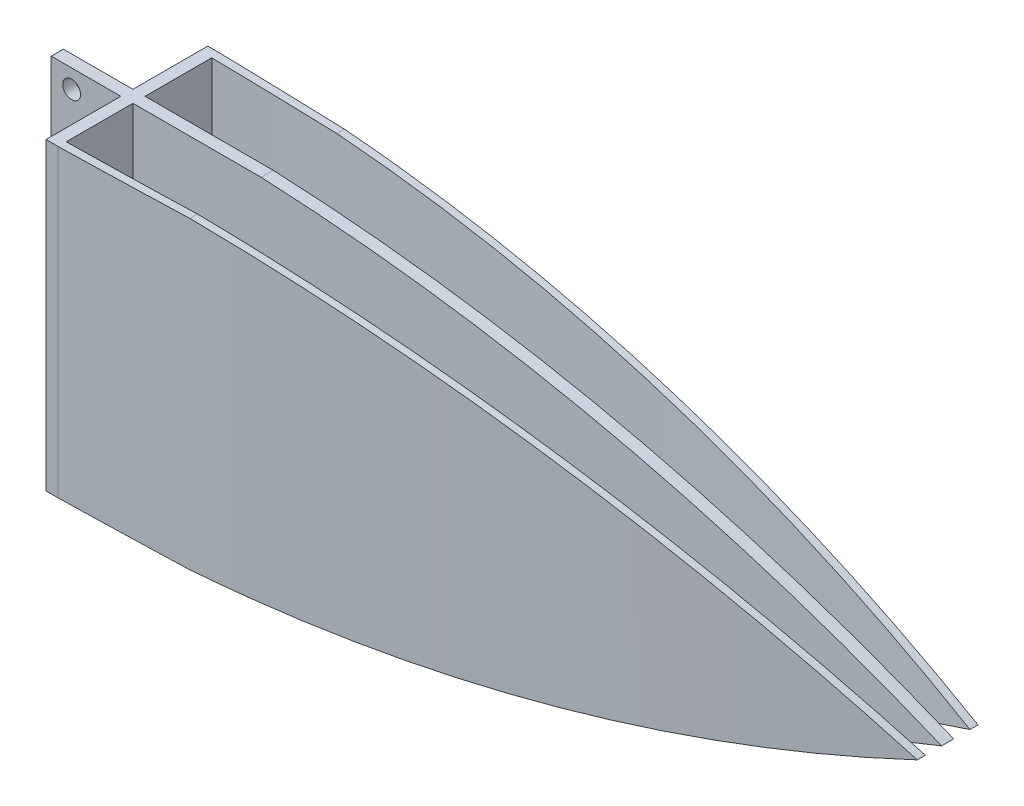
ISO-10303-21;
HEADER;
FILE_DESCRIPTION(('STEP AP214'),'2;1');
FILE_NAME('part.step','',(''),(''),'','','');
FILE_SCHEMA(('AUTOMOTIVE_DESIGN { 1 0 10303 214 1 1 1 1 }'));
ENDSEC;
DATA;
#1=APPLICATION_CONTEXT('core data for automotive mechanical design processes');
#2=APPLICATION_PROTOCOL_DEFINITION('international standard','automotive_design',2000,#1);
#3=PRODUCT_CONTEXT('',#1,'mechanical');
#4=PRODUCT('Part','Part','',(#3));
#5=PRODUCT_RELATED_PRODUCT_CATEGORY('part','',(#4));
#6=PRODUCT_DEFINITION_FORMATION('','',#4);
#7=PRODUCT_DEFINITION_CONTEXT('part definition',#1,'design');
#8=PRODUCT_DEFINITION('design','',#6,#7);
#9=PRODUCT_DEFINITION_SHAPE('','',#8);
#10=(LENGTH_UNIT() NAMED_UNIT(*) SI_UNIT(.MILLI.,.METRE.));
#11=(NAMED_UNIT(*) PLANE_ANGLE_UNIT() SI_UNIT($,.RADIAN.));
#12=(NAMED_UNIT(*) SI_UNIT($,.STERADIAN.) SOLID_ANGLE_UNIT());
#13=UNCERTAINTY_MEASURE_WITH_UNIT(LENGTH_MEASURE(1.E-05),#10,'distance_accuracy_value','');
#14=(GEOMETRIC_REPRESENTATION_CONTEXT(3) GLOBAL_UNCERTAINTY_ASSIGNED_CONTEXT((#13)) GLOBAL_UNIT_ASSIGNED_CONTEXT((#10,
#11,#12)) REPRESENTATION_CONTEXT('',''));
#15=CARTESIAN_POINT('',(0.,0.,0.));
#16=DIRECTION('',(0.,0.,1.));
#17=DIRECTION('',(1.,0.,0.));
#18=AXIS2_PLACEMENT_3D('',#15,#16,#17);
#19=CARTESIAN_POINT('',(-17.2852084932397,-18.2647657841141,-1086.68833589183));
#20=DIRECTION('',(0.,1.,0.));
#21=DIRECTION('',(-1.,0.,0.));
#22=AXIS2_PLACEMENT_3D('',#19,#20,#21);
#23=CYLINDRICAL_SURFACE('',#22,1095.84090006673);
#24=CARTESIAN_POINT('',(13.103688800574,-18.2380913098096,8.73112403222787));
#25=CARTESIAN_POINT('',(14.9986741159179,-18.1821595298657,8.67855571875341));
#26=CARTESIAN_POINT('',(16.8928070961871,-18.104431262455,8.6210855583314));
#27=CARTESIAN_POINT('',(20.6784628465838,-17.9054482740115,8.49640837568931));
#28=CARTESIAN_POINT('',(22.5699856191637,-17.7841935939041,8.42920136262424));
#29=CARTESIAN_POINT('',(28.2389529228422,-17.3552646728917,8.21308781497228));
#30=CARTESIAN_POINT('',(32.0111304158066,-16.9824156790888,8.04967949234752));
#31=CARTESIAN_POINT('',(39.5001416334272,-16.0679334220321,7.68666300479193));
#32=CARTESIAN_POINT('',(43.2171725545415,-15.5277750081056,7.48737729315888));
#33=CARTESIAN_POINT('',(50.6207551394182,-14.2791054574376,7.05286206323423));
#34=CARTESIAN_POINT('',(54.3073068812434,-13.5705947520147,6.817632637031));
#35=CARTESIAN_POINT('',(61.6419552564059,-11.9870546062361,6.31271345795367));
#36=CARTESIAN_POINT('',(65.290053111482,-11.1120304731986,6.04302480349593));
#37=CARTESIAN_POINT('',(72.5402577307319,-9.19763453953254,5.4709418843329));
#38=CARTESIAN_POINT('',(76.1423640874289,-8.15826128388963,5.16854733008348));
#39=CARTESIAN_POINT('',(83.3242254734376,-5.90791883093385,4.5303073083697));
#40=CARTESIAN_POINT('',(86.9035170827257,-4.69554207711856,4.19419492902983));
#41=CARTESIAN_POINT('',(92.2258030985259,-2.75578306800186,3.66839327245229));
#42=CARTESIAN_POINT('',(93.9921713815322,-2.0889776463933,3.48951529583038));
#43=CARTESIAN_POINT('',(97.5085473383613,-0.715332669655094,3.12485754354286));
#44=CARTESIAN_POINT('',(99.258555061766,-0.00849323589739606,2.93907778880211));
#45=CARTESIAN_POINT('',(101.,0.718187038830978,2.74999999999979));
#46=B_SPLINE_CURVE_WITH_KNOTS('',3,(#24,#25,#26,#27,#28,#29,#30,#31,#32,#33,#34,#35,#36,#37,#38,
#39,#40,#41,#42,#43,#44,#45),.UNSPECIFIED.,.F.,.F.,(4,2,2,2,2,2,2,2,2,2,4),(0.,5.6893405528307,
11.3786757563252,22.7563444181236,34.0364425308723,45.3165117443128,56.5962214858857,
67.8760310944907,79.2534859656059,84.942527898806,90.6315525853426),.UNSPECIFIED.);
#47=CARTESIAN_POINT('',(16.7923479325538,-18.1016450332281,8.62257814449768));
#48=VERTEX_POINT('',#47);
#49=CARTESIAN_POINT('',(101.,0.718187038831003,2.74999999999981));
#50=VERTEX_POINT('',#49);
#51=EDGE_CURVE('E348',#48,#50,#46,.T.);
#52=ORIENTED_EDGE('',*,*,#51,.F.);
#53=CARTESIAN_POINT('',(-17.2852084932397,-18.1016450332279,-1086.68833589183));
#54=DIRECTION('',(0.,-1.,0.));
#55=DIRECTION('',(0.,0.,-1.));
#56=AXIS2_PLACEMENT_3D('',#53,#54,#55);
#57=CIRCLE('',#56,1095.84090006673);
#58=CARTESIAN_POINT('',(1.,-18.1016450332281,8.9999999999999));
#59=VERTEX_POINT('',#58);
#60=EDGE_CURVE('E54',#48,#59,#57,.T.);
#61=ORIENTED_EDGE('',*,*,#60,.T.);
#62=DIRECTION('',(0.,1.,0.));
#63=VECTOR('',#62,1.);
#64=CARTESIAN_POINT('',(1.00000000000001,-18.264765784114,9.));
#65=LINE('',#64,#63);
#66=CARTESIAN_POINT('',(1.,19.535234215886,9.));
#67=VERTEX_POINT('',#66);
#68=EDGE_CURVE('E365',#59,#67,#65,.T.);
#69=ORIENTED_EDGE('',*,*,#68,.T.);
#70=CARTESIAN_POINT('',(-17.2852084932397,19.5352342158859,-1086.68833589183));
#71=DIRECTION('',(0.,1.,0.));
#72=DIRECTION('',(-1.,0.,0.));
#73=AXIS2_PLACEMENT_3D('',#70,#71,#72);
#74=CIRCLE('',#73,1095.84090006673);
#75=CARTESIAN_POINT('',(16.8547942960303,19.535234215886,8.6206335175314));
#76=VERTEX_POINT('',#75);
#77=EDGE_CURVE('E269',#67,#76,#74,.T.);
#78=ORIENTED_EDGE('',*,*,#77,.T.);
#79=CARTESIAN_POINT('',(101.,0.718187038831114,2.74999999999981));
#80=CARTESIAN_POINT('',(99.2585550617661,1.44486731355951,2.93907778880233));
#81=CARTESIAN_POINT('',(97.5085473383614,2.15170674731721,3.12485754354307));
#82=CARTESIAN_POINT('',(93.9921713815323,3.52535172405541,3.48951529583042));
#83=CARTESIAN_POINT('',(92.2258030985259,4.19215714566396,3.66839327245217));
#84=CARTESIAN_POINT('',(86.9035170827257,6.13191615478065,4.19419492902944));
#85=CARTESIAN_POINT('',(83.3242254734376,7.34429290859596,4.53030730836937));
#86=CARTESIAN_POINT('',(76.1423640874289,9.59463536155176,5.16854733008339));
#87=CARTESIAN_POINT('',(72.5402577307319,10.6340086171947,5.47094188433297));
#88=CARTESIAN_POINT('',(65.290053111482,12.5484045508607,6.0430248034961));
#89=CARTESIAN_POINT('',(61.6419552564059,13.4234286838981,6.31271345795376));
#90=CARTESIAN_POINT('',(54.3073068812433,15.0069688296768,6.81763263703093));
#91=CARTESIAN_POINT('',(50.6207551394182,15.7154795350997,7.05286206323405));
#92=CARTESIAN_POINT('',(43.2171725545414,16.9641490857678,7.48737729315868));
#93=CARTESIAN_POINT('',(39.5001416334271,17.5043074996942,7.6866630047918));
#94=CARTESIAN_POINT('',(32.0111304158065,18.4187897567509,8.04967949234764));
#95=CARTESIAN_POINT('',(28.2389529228421,18.7916387505538,8.21308781497258));
#96=CARTESIAN_POINT('',(22.5699856191637,19.2205676715662,8.42920136262438));
#97=CARTESIAN_POINT('',(20.6784628465837,19.3418223516736,8.49640837568933));
#98=CARTESIAN_POINT('',(16.892807096187,19.5408053401171,8.62108555833128));
#99=CARTESIAN_POINT('',(14.9986741159178,19.6185336075278,8.67855571875326));
#100=CARTESIAN_POINT('',(13.1036888005739,19.6744653874718,8.73112403222786));
#101=B_SPLINE_CURVE_WITH_KNOTS('',3,(#79,#80,#81,#82,#83,#84,#85,#86,#87,#88,#89,#90,#91,#92,
#93,#94,#95,#96,#97,#98,#99,#100),.UNSPECIFIED.,.F.,.F.,(4,2,2,2,2,2,2,2,2,2,4),(0.,
5.68902468653662,11.3780666197367,22.755521490852,34.0353310994569,45.3150408410299,
56.5951100544705,67.8752081672192,79.2528768290175,84.9422120325121,90.6315525853428),.UNSPECIFIED.);
#102=EDGE_CURVE('E322',#50,#76,#101,.T.);
#103=ORIENTED_EDGE('',*,*,#102,.F.);
#104=EDGE_LOOP('',(#52,#61,#69,#78,#103));
#105=FACE_BOUND('',#104,.T.);
#106=ADVANCED_FACE('F38',(#105),#23,.F.);
#107=CARTESIAN_POINT('',(-25.1770830974539,-18.2647657841141,-1211.95832955926));
#108=DIRECTION('',(0.,1.,0.));
#109=DIRECTION('',(-1.,0.,0.));
#110=AXIS2_PLACEMENT_3D('',#107,#108,#109);
#111=CYLINDRICAL_SURFACE('',#110,1222.23868326066);
#112=DIRECTION('',(0.,-1.,0.));
#113=VECTOR('',#112,1.);
#114=CARTESIAN_POINT('',(1.,19.735234215886,10.));
#115=LINE('',#114,#113);
#116=CARTESIAN_POINT('',(1.,19.535234215886,10.));
#117=VERTEX_POINT('',#116);
#118=CARTESIAN_POINT('',(1.,-18.1016450332281,9.99999999999999));
#119=VERTEX_POINT('',#118);
#120=EDGE_CURVE('E397',#117,#119,#115,.T.);
#121=ORIENTED_EDGE('',*,*,#120,.T.);
#122=CARTESIAN_POINT('',(-25.1770830974539,-18.1016450332279,-1211.95832955926));
#123=DIRECTION('',(0.,-1.,0.));
#124=DIRECTION('',(0.,0.,-1.));
#125=AXIS2_PLACEMENT_3D('',#122,#123,#124);
#126=CIRCLE('',#125,1222.23868326066);
#127=CARTESIAN_POINT('',(16.7923479325538,-18.1016450332281,9.55956458628426));
#128=VERTEX_POINT('',#127);
#129=EDGE_CURVE('E449',#119,#128,#126,.F.);
#130=ORIENTED_EDGE('',*,*,#129,.T.);
#131=CARTESIAN_POINT('',(101.,0.718187038831058,3.74999999999992));
#132=CARTESIAN_POINT('',(99.258003019389,-0.00872359932098572,3.93080120117452));
#133=CARTESIAN_POINT('',(97.507486229986,-0.71576062039269,4.10869942642488));
#134=CARTESIAN_POINT('',(93.990180967723,-2.08974173621458,4.45841038746494));
#135=CARTESIAN_POINT('',(92.2233924532046,-2.75668572828718,4.63022310766929));
#136=CARTESIAN_POINT('',(86.899990629276,-4.69677912966614,5.13609276355491));
#137=CARTESIAN_POINT('',(83.3201386873285,-5.90927440835207,5.46060224289145));
#138=CARTESIAN_POINT('',(76.1372654081746,-8.15978439048723,6.0793080170652));
#139=CARTESIAN_POINT('',(72.5347008550286,-9.19919677168643,6.37373888197213));
#140=CARTESIAN_POINT('',(65.2838916358919,-11.1135622899455,6.93355730676975));
#141=CARTESIAN_POINT('',(61.6356473296942,-11.9885167214772,7.19894509525575));
#142=CARTESIAN_POINT('',(54.3009988799346,-13.571856222557,7.69905892584603));
#143=CARTESIAN_POINT('',(50.6145937080462,-14.2802367911514,7.93378413934783));
#144=CARTESIAN_POINT('',(43.2115237647445,-15.5286354051633,8.37119447025042));
#145=CARTESIAN_POINT('',(39.494858916655,-16.068653023823,8.57387950643676));
#146=CARTESIAN_POINT('',(32.0069914904187,-16.982845824652,8.94770709060366));
#147=CARTESIAN_POINT('',(28.2355946007829,-17.3555580452391,9.11856402722967));
#148=CARTESIAN_POINT('',(22.5678553522702,-17.784335113017,9.34891986239949));
#149=CARTESIAN_POINT('',(20.6767535886379,-17.9055479967174,9.42138609850683));
#150=CARTESIAN_POINT('',(16.891948427009,-18.1044665100688,9.55760639820794));
#151=CARTESIAN_POINT('',(14.9982450268907,-18.1821721042153,9.62136045469202));
#152=CARTESIAN_POINT('',(13.1036888005739,-18.2380913098096,9.68072571101025));
#153=B_SPLINE_CURVE_WITH_KNOTS('',3,(#131,#132,#133,#134,#135,#136,#137,#138,#139,#140,#141,
#142,#143,#144,#145,#146,#147,#148,#149,#150,#151,#152),.UNSPECIFIED.,.F.,.F.,(4,2,2,2,2,2,2,2,
2,2,4),(0.,5.68838999298516,11.3767945532229,22.7529434902618,34.0322328094434,45.3114333440195,
56.5909386162426,67.8704724789469,79.2468027345779,84.9354560007952,90.6241139092895),.UNSPECIFIED.);
#154=CARTESIAN_POINT('',(101.,0.718187038831003,3.7499999999997));
#155=VERTEX_POINT('',#154);
#156=EDGE_CURVE('E339',#155,#128,#153,.T.);
#157=ORIENTED_EDGE('',*,*,#156,.F.);
#158=CARTESIAN_POINT('',(13.1036888005739,19.6744653874718,9.68072571101031));
#159=CARTESIAN_POINT('',(14.9982450268906,19.6185461818774,9.62136045469184));
#160=CARTESIAN_POINT('',(16.891948427009,19.5408405877309,9.55760639820773));
#161=CARTESIAN_POINT('',(20.6767535886378,19.3419220743795,9.4213860985067));
#162=CARTESIAN_POINT('',(22.5678553522702,19.2207091906791,9.34891986239947));
#163=CARTESIAN_POINT('',(28.2355946007828,18.7919321229012,9.11856402722984));
#164=CARTESIAN_POINT('',(32.0069914904186,18.4192199023141,8.94770709060374));
#165=CARTESIAN_POINT('',(39.494858916655,17.5050271014851,8.57387950643675));
#166=CARTESIAN_POINT('',(43.2115237647444,16.9650094828254,8.37119447025044));
#167=CARTESIAN_POINT('',(50.6145937080461,15.7166108688135,7.93378413934786));
#168=CARTESIAN_POINT('',(54.3009988799345,15.0082303002191,7.69905892584604));
#169=CARTESIAN_POINT('',(61.6356473296941,13.4248907991393,7.19894509525575));
#170=CARTESIAN_POINT('',(65.2838916358918,12.5499363676076,6.93355730676975));
#171=CARTESIAN_POINT('',(72.5347008550285,10.6355708493486,6.37373888197212));
#172=CARTESIAN_POINT('',(76.1372654081745,9.59615846814937,6.07930801706518));
#173=CARTESIAN_POINT('',(83.3201386873284,7.34564848601421,5.46060224289142));
#174=CARTESIAN_POINT('',(86.8999906292759,6.13315320732831,5.13609276355489));
#175=CARTESIAN_POINT('',(92.2233924532045,4.19305980594936,4.63022310766926));
#176=CARTESIAN_POINT('',(93.9901809677229,3.52611581387676,4.4584103874649));
#177=CARTESIAN_POINT('',(97.5074862299859,2.15213469805488,4.10869942642484));
#178=CARTESIAN_POINT('',(99.2580030193888,1.44509767698317,3.93080120117448));
#179=CARTESIAN_POINT('',(101.,0.718187038831122,3.74999999999987));
#180=B_SPLINE_CURVE_WITH_KNOTS('',3,(#158,#159,#160,#161,#162,#163,#164,#165,#166,#167,#168,
#169,#170,#171,#172,#173,#174,#175,#176,#177,#178,#179),.UNSPECIFIED.,.F.,.F.,(4,2,2,2,2,2,2,2,
2,2,4),(0.,5.68865790849438,11.3773111747117,22.7536414303427,34.0331752930469,45.31268056527,
56.5918810998461,67.8711704190277,79.2473193560666,84.9357239163043,90.6241139092895),.UNSPECIFIED.);
#181=CARTESIAN_POINT('',(16.854794296037,19.535234215886,9.55741742950722));
#182=VERTEX_POINT('',#181);
#183=EDGE_CURVE('E315',#182,#155,#180,.T.);
#184=ORIENTED_EDGE('',*,*,#183,.F.);
#185=CARTESIAN_POINT('',(-25.1770830974539,19.5352342158859,-1211.95832955926));
#186=DIRECTION('',(0.,1.,0.));
#187=DIRECTION('',(-1.,0.,0.));
#188=AXIS2_PLACEMENT_3D('',#185,#186,#187);
#189=CIRCLE('',#188,1222.23868326066);
#190=EDGE_CURVE('E276',#182,#117,#189,.F.);
#191=ORIENTED_EDGE('',*,*,#190,.T.);
#192=EDGE_LOOP('',(#121,#130,#157,#184,#191));
#193=FACE_BOUND('',#192,.T.);
#194=ADVANCED_FACE('F329',(#193),#111,.T.);
#195=CARTESIAN_POINT('',(-17.2852084932396,-18.2647657841141,1086.68833589183));
#196=DIRECTION('',(0.,1.,0.));
#197=DIRECTION('',(-1.,0.,0.));
#198=AXIS2_PLACEMENT_3D('',#195,#196,#197);
#199=CYLINDRICAL_SURFACE('',#198,1095.84090006673);
#200=DIRECTION('',(0.,1.,0.));
#201=VECTOR('',#200,1.);
#202=CARTESIAN_POINT('',(1.00000000000001,-18.264765784114,-9.));
#203=LINE('',#202,#201);
#204=CARTESIAN_POINT('',(1.,-18.1016450332281,-8.99999999999995));
#205=VERTEX_POINT('',#204);
#206=CARTESIAN_POINT('',(1.00000000000001,19.535234215886,-8.9999999999999));
#207=VERTEX_POINT('',#206);
#208=EDGE_CURVE('E362',#205,#207,#203,.T.);
#209=ORIENTED_EDGE('',*,*,#208,.F.);
#210=CARTESIAN_POINT('',(-17.2852084932396,-18.1016450332283,1086.68833589183));
#211=DIRECTION('',(0.,-1.,0.));
#212=DIRECTION('',(0.,0.,-1.));
#213=AXIS2_PLACEMENT_3D('',#210,#211,#212);
#214=CIRCLE('',#213,1095.84090006673);
#215=CARTESIAN_POINT('',(16.7923479325544,-18.1016450332281,-8.62257814449752));
#216=VERTEX_POINT('',#215);
#217=EDGE_CURVE('E517',#205,#216,#214,.T.);
#218=ORIENTED_EDGE('',*,*,#217,.T.);
#219=CARTESIAN_POINT('',(101.,0.718187038831086,-2.74999999999981));
#220=CARTESIAN_POINT('',(99.2585550617663,-0.00849323589727626,-2.93907778880233));
#221=CARTESIAN_POINT('',(97.5085473383616,-0.715332669654972,-3.12485754354308));
#222=CARTESIAN_POINT('',(93.9921713815325,-2.08897764639318,-3.48951529583042));
#223=CARTESIAN_POINT('',(92.2258030985262,-2.75578306800174,-3.66839327245218));
#224=CARTESIAN_POINT('',(86.9035170827259,-4.69554207711846,-4.19419492902944));
#225=CARTESIAN_POINT('',(83.3242254734378,-5.90791883093376,-4.53030730836938));
#226=CARTESIAN_POINT('',(76.1423640874291,-8.15826128388957,-5.1685473300834));
#227=CARTESIAN_POINT('',(72.5402577307321,-9.1976345395325,-5.47094188433299));
#228=CARTESIAN_POINT('',(65.2900531114822,-11.1120304731985,-6.04302480349611));
#229=CARTESIAN_POINT('',(61.641955256406,-11.987054606236,-6.31271345795378));
#230=CARTESIAN_POINT('',(54.3073068812435,-13.5705947520146,-6.81763263703094));
#231=CARTESIAN_POINT('',(50.6207551394183,-14.2791054574375,-7.05286206323407));
#232=CARTESIAN_POINT('',(43.2171725545415,-15.5277750081056,-7.4873772931587));
#233=CARTESIAN_POINT('',(39.5001416334273,-16.0679334220321,-7.68666300479182));
#234=CARTESIAN_POINT('',(32.0111304158067,-16.9824156790888,-8.04967949234766));
#235=CARTESIAN_POINT('',(28.2389529228423,-17.3552646728917,-8.2130878149726));
#236=CARTESIAN_POINT('',(22.5699856191638,-17.7841935939041,-8.42920136262441));
#237=CARTESIAN_POINT('',(20.6784628465838,-17.9054482740115,-8.49640837568935));
#238=CARTESIAN_POINT('',(16.8928070961871,-18.1044312624549,-8.6210855583313));
#239=CARTESIAN_POINT('',(14.9986741159179,-18.1821595298657,-8.67855571875329));
#240=CARTESIAN_POINT('',(13.103688800574,-18.2380913098097,-8.73112403222789));
#241=B_SPLINE_CURVE_WITH_KNOTS('',3,(#219,#220,#221,#222,#223,#224,#225,#226,#227,#228,#229,
#230,#231,#232,#233,#234,#235,#236,#237,#238,#239,#240),.UNSPECIFIED.,.F.,.F.,(4,2,2,2,2,2,2,2,
2,2,4),(0.,5.68902468653664,11.3780666197367,22.755521490852,34.035331099457,45.31504084103,
56.5951100544706,67.8752081672192,79.2528768290176,84.9422120325122,90.6315525853429),.UNSPECIFIED.);
#242=CARTESIAN_POINT('',(101.,0.718187038831003,-2.75));
#243=VERTEX_POINT('',#242);
#244=EDGE_CURVE('E349',#243,#216,#241,.T.);
#245=ORIENTED_EDGE('',*,*,#244,.F.);
#246=CARTESIAN_POINT('',(13.1036888005739,19.6744653874718,-8.73112403222787));
#247=CARTESIAN_POINT('',(14.9986741159178,19.6185336075278,-8.67855571875326));
#248=CARTESIAN_POINT('',(16.892807096187,19.5408053401171,-8.62108555833127));
#249=CARTESIAN_POINT('',(20.6784628465837,19.3418223516736,-8.49640837568932));
#250=CARTESIAN_POINT('',(22.5699856191637,19.2205676715662,-8.42920136262438));
#251=CARTESIAN_POINT('',(28.2389529228422,18.7916387505538,-8.21308781497258));
#252=CARTESIAN_POINT('',(32.0111304158066,18.4187897567509,-8.04967949234764));
#253=CARTESIAN_POINT('',(39.5001416334271,17.5043074996943,-7.6866630047918));
#254=CARTESIAN_POINT('',(43.2171725545414,16.9641490857678,-7.48737729315867));
#255=CARTESIAN_POINT('',(50.6207551394182,15.7154795350997,-7.05286206323405));
#256=CARTESIAN_POINT('',(54.3073068812434,15.0069688296768,-6.81763263703092));
#257=CARTESIAN_POINT('',(61.6419552564059,13.4234286838982,-6.31271345795376));
#258=CARTESIAN_POINT('',(65.290053111482,12.5484045508607,-6.04302480349609));
#259=CARTESIAN_POINT('',(72.5402577307319,10.6340086171947,-5.47094188433297));
#260=CARTESIAN_POINT('',(76.1423640874289,9.59463536155178,-5.16854733008338));
#261=CARTESIAN_POINT('',(83.3242254734376,7.34429290859598,-4.53030730836936));
#262=CARTESIAN_POINT('',(86.9035170827257,6.13191615478065,-4.19419492902943));
#263=CARTESIAN_POINT('',(92.225803098526,4.19215714566394,-3.66839327245216));
#264=CARTESIAN_POINT('',(93.9921713815323,3.52535172405539,-3.48951529583041));
#265=CARTESIAN_POINT('',(97.5085473383614,2.1517067473172,-3.12485754354306));
#266=CARTESIAN_POINT('',(99.2585550617661,1.44486731355951,-2.93907778880232));
#267=CARTESIAN_POINT('',(101.,0.718187038831127,-2.74999999999979));
#268=B_SPLINE_CURVE_WITH_KNOTS('',3,(#246,#247,#248,#249,#250,#251,#252,#253,#254,#255,#256,
#257,#258,#259,#260,#261,#262,#263,#264,#265,#266,#267),.UNSPECIFIED.,.F.,.F.,(4,2,2,2,2,2,2,2,
2,2,4),(0.,5.68934055283071,11.3786757563253,22.7563444181236,34.0364425308723,45.3165117443128,
56.5962214858858,67.8760310944908,79.2534859656061,84.9425278988062,90.6315525853428),.UNSPECIFIED.);
#269=CARTESIAN_POINT('',(16.854794296037,19.5352342158859,-8.62063351753113));
#270=VERTEX_POINT('',#269);
#271=EDGE_CURVE('E290',#270,#243,#268,.T.);
#272=ORIENTED_EDGE('',*,*,#271,.F.);
#273=CARTESIAN_POINT('',(-17.2852084932397,19.5352342158859,1086.68833589183));
#274=DIRECTION('',(0.,1.,0.));
#275=DIRECTION('',(-1.,0.,0.));
#276=AXIS2_PLACEMENT_3D('',#273,#274,#275);
#277=CIRCLE('',#276,1095.84090006673);
#278=EDGE_CURVE('E62',#270,#207,#277,.T.);
#279=ORIENTED_EDGE('',*,*,#278,.T.);
#280=EDGE_LOOP('',(#209,#218,#245,#272,#279));
#281=FACE_BOUND('',#280,.T.);
#282=ADVANCED_FACE('F332',(#281),#199,.F.);
#283=CARTESIAN_POINT('',(-25.1770830974539,-18.2647657841141,1211.95832955926));
#284=DIRECTION('',(0.,1.,0.));
#285=DIRECTION('',(-1.,0.,0.));
#286=AXIS2_PLACEMENT_3D('',#283,#284,#285);
#287=CYLINDRICAL_SURFACE('',#286,1222.23868326066);
#288=CARTESIAN_POINT('',(13.103688800574,-18.2380913098096,-9.68072571101031));
#289=CARTESIAN_POINT('',(14.9982450268907,-18.1821721042153,-9.62136045469184));
#290=CARTESIAN_POINT('',(16.891948427009,-18.1044665100688,-9.55760639820773));
#291=CARTESIAN_POINT('',(20.6767535886379,-17.9055479967174,-9.4213860985067));
#292=CARTESIAN_POINT('',(22.5678553522702,-17.784335113017,-9.34891986239947));
#293=CARTESIAN_POINT('',(28.2355946007829,-17.3555580452391,-9.11856402722984));
#294=CARTESIAN_POINT('',(32.0069914904186,-16.982845824652,-8.94770709060374));
#295=CARTESIAN_POINT('',(39.494858916655,-16.068653023823,-8.57387950643675));
#296=CARTESIAN_POINT('',(43.2115237647445,-15.5286354051633,-8.37119447025043));
#297=CARTESIAN_POINT('',(50.6145937080462,-14.2802367911514,-7.93378413934785));
#298=CARTESIAN_POINT('',(54.3009988799346,-13.5718562225569,-7.69905892584604));
#299=CARTESIAN_POINT('',(61.6356473296941,-11.9885167214772,-7.19894509525575));
#300=CARTESIAN_POINT('',(65.2838916358919,-11.1135622899455,-6.93355730676975));
#301=CARTESIAN_POINT('',(72.5347008550286,-9.19919677168648,-6.37373888197211));
#302=CARTESIAN_POINT('',(76.1372654081746,-8.15978439048728,-6.07930801706518));
#303=CARTESIAN_POINT('',(83.3201386873285,-5.90927440835208,-5.46060224289142));
#304=CARTESIAN_POINT('',(86.8999906292759,-4.69677912966613,-5.13609276355488));
#305=CARTESIAN_POINT('',(92.2233924532045,-2.75668572828721,-4.63022310766925));
#306=CARTESIAN_POINT('',(93.9901809677229,-2.08974173621464,-4.4584103874649));
#307=CARTESIAN_POINT('',(97.507486229986,-0.715760620392782,-4.10869942642483));
#308=CARTESIAN_POINT('',(99.2580030193889,-0.00872359932107549,-3.93080120117447));
#309=CARTESIAN_POINT('',(101.,0.718187038831019,-3.74999999999987));
#310=B_SPLINE_CURVE_WITH_KNOTS('',3,(#288,#289,#290,#291,#292,#293,#294,#295,#296,#297,#298,
#299,#300,#301,#302,#303,#304,#305,#306,#307,#308,#309),.UNSPECIFIED.,.F.,.F.,(4,2,2,2,2,2,2,2,
2,2,4),(0.,5.68865790849438,11.3773111747116,22.7536414303426,34.0331752930469,45.31268056527,
56.5918810998461,67.8711704190276,79.2473193560665,84.9357239163043,90.6241139092894),.UNSPECIFIED.);
#311=CARTESIAN_POINT('',(16.7923479325538,-18.1016450332281,-9.55956458628426));
#312=VERTEX_POINT('',#311);
#313=CARTESIAN_POINT('',(101.,0.718187038831003,-3.7499999999997));
#314=VERTEX_POINT('',#313);
#315=EDGE_CURVE('E465',#312,#314,#310,.T.);
#316=ORIENTED_EDGE('',*,*,#315,.F.);
#317=CARTESIAN_POINT('',(-25.1770830974539,-18.1016450332283,1211.95832955926));
#318=DIRECTION('',(0.,-1.,0.));
#319=DIRECTION('',(0.,0.,-1.));
#320=AXIS2_PLACEMENT_3D('',#317,#318,#319);
#321=CIRCLE('',#320,1222.23868326066);
#322=CARTESIAN_POINT('',(0.99999999999989,-18.1016450332281,-9.99999999999979));
#323=VERTEX_POINT('',#322);
#324=EDGE_CURVE('E509',#312,#323,#321,.F.);
#325=ORIENTED_EDGE('',*,*,#324,.T.);
#326=DIRECTION('',(0.,1.,0.));
#327=VECTOR('',#326,1.);
#328=CARTESIAN_POINT('',(0.999999999999795,-18.264765784114,-9.99999999999979));
#329=LINE('',#328,#327);
#330=CARTESIAN_POINT('',(0.999999999999789,19.535234215886,-9.99999999999979));
#331=VERTEX_POINT('',#330);
#332=EDGE_CURVE('E361',#323,#331,#329,.T.);
#333=ORIENTED_EDGE('',*,*,#332,.T.);
#334=CARTESIAN_POINT('',(-25.1770830974539,19.5352342158859,1211.95832955926));
#335=DIRECTION('',(0.,1.,0.));
#336=DIRECTION('',(-1.,0.,0.));
#337=AXIS2_PLACEMENT_3D('',#334,#335,#336);
#338=CIRCLE('',#337,1222.23868326066);
#339=CARTESIAN_POINT('',(16.854794296037,19.535234215886,-9.55741742950722));
#340=VERTEX_POINT('',#339);
#341=EDGE_CURVE('E227',#331,#340,#338,.F.);
#342=ORIENTED_EDGE('',*,*,#341,.T.);
#343=CARTESIAN_POINT('',(101.,0.718187038831114,-3.7499999999997));
#344=CARTESIAN_POINT('',(99.2580030193889,1.44509767698317,-3.93080120117444));
#345=CARTESIAN_POINT('',(97.5074862299859,2.15213469805488,-4.10869942642482));
#346=CARTESIAN_POINT('',(93.9901809677229,3.52611581387677,-4.45841038746483));
#347=CARTESIAN_POINT('',(92.2233924532045,4.19305980594937,-4.63022310766912));
#348=CARTESIAN_POINT('',(86.8999906292759,6.13315320732832,-5.13609276355475));
#349=CARTESIAN_POINT('',(83.3201386873285,7.34564848601421,-5.46060224289155));
#350=CARTESIAN_POINT('',(76.1372654081745,9.59615846814937,-6.07930801706531));
#351=CARTESIAN_POINT('',(72.5347008550285,10.6355708493486,-6.37373888197199));
#352=CARTESIAN_POINT('',(65.2838916358918,12.5499363676076,-6.93355730676953));
#353=CARTESIAN_POINT('',(61.6356473296941,13.4248907991393,-7.19894509525569));
#354=CARTESIAN_POINT('',(54.3009988799345,15.0082303002191,-7.69905892584608));
#355=CARTESIAN_POINT('',(50.6145937080461,15.7166108688135,-7.93378413934783));
#356=CARTESIAN_POINT('',(43.2115237647444,16.9650094828254,-8.37119447025045));
#357=CARTESIAN_POINT('',(39.494858916655,17.5050271014851,-8.57387950643687));
#358=CARTESIAN_POINT('',(32.0069914904186,18.4192199023141,-8.94770709060376));
#359=CARTESIAN_POINT('',(28.2355946007829,18.7919321229012,-9.11856402722966));
#360=CARTESIAN_POINT('',(22.5678553522702,19.2207091906791,-9.34891986239943));
#361=CARTESIAN_POINT('',(20.6767535886379,19.3419220743795,-9.42138609850677));
#362=CARTESIAN_POINT('',(16.891948427009,19.5408405877309,-9.55760639820795));
#363=CARTESIAN_POINT('',(14.9982450268906,19.6185461818774,-9.62136045469209));
#364=CARTESIAN_POINT('',(13.1036888005739,19.6744653874718,-9.68072571101045));
#365=B_SPLINE_CURVE_WITH_KNOTS('',3,(#343,#344,#345,#346,#347,#348,#349,#350,#351,#352,#353,
#354,#355,#356,#357,#358,#359,#360,#361,#362,#363,#364),.UNSPECIFIED.,.F.,.F.,(4,2,2,2,2,2,2,2,
2,2,4),(0.,5.68838999298517,11.3767945532229,22.7529434902618,34.0322328094434,45.3114333440195,
56.5909386162425,67.8704724789468,79.2468027345778,84.9354560007951,90.6241139092894),.UNSPECIFIED.);
#366=EDGE_CURVE('E280',#314,#340,#365,.T.);
#367=ORIENTED_EDGE('',*,*,#366,.F.);
#368=EDGE_LOOP('',(#316,#325,#333,#342,#367));
#369=FACE_BOUND('',#368,.T.);
#370=ADVANCED_FACE('F297',(#369),#287,.T.);
#371=CARTESIAN_POINT('',(0.,0.,-0.75));
#372=DIRECTION('',(0.,0.,1.));
#373=DIRECTION('',(1.,0.,0.));
#374=AXIS2_PLACEMENT_3D('',#371,#372,#373);
#375=PLANE('',#374);
#376=CARTESIAN_POINT('',(-6.60183299389003,-15.7647657841141,-0.75));
#377=DIRECTION('',(0.,0.,1.));
#378=DIRECTION('',(1.,0.,0.));
#379=AXIS2_PLACEMENT_3D('',#376,#377,#378);
#380=CIRCLE('',#379,1.1);
#381=CARTESIAN_POINT('',(-5.50183299389003,-15.7647657841141,-0.75));
#382=VERTEX_POINT('',#381);
#383=EDGE_CURVE('E427',#382,#382,#380,.T.);
#384=ORIENTED_EDGE('',*,*,#383,.T.);
#385=EDGE_LOOP('',(#384));
#386=FACE_BOUND('',#385,.T.);
#387=CARTESIAN_POINT('',(-6.57841140529532,17.2352342158859,-0.75));
#388=DIRECTION('',(0.,0.,1.));
#389=DIRECTION('',(1.,0.,0.));
#390=AXIS2_PLACEMENT_3D('',#387,#388,#389);
#391=CIRCLE('',#390,1.1);
#392=CARTESIAN_POINT('',(-5.47841140529532,17.2352342158859,-0.75));
#393=VERTEX_POINT('',#392);
#394=EDGE_CURVE('E423',#393,#393,#391,.T.);
#395=ORIENTED_EDGE('',*,*,#394,.T.);
#396=EDGE_LOOP('',(#395));
#397=FACE_BOUND('',#396,.T.);
#398=DIRECTION('',(0.,1.,0.));
#399=VECTOR('',#398,1.);
#400=CARTESIAN_POINT('',(-0.716018878796458,0.,-0.75));
#401=LINE('',#400,#399);
#402=CARTESIAN_POINT('',(-0.716018878796458,-18.2647657841141,-0.75));
#403=VERTEX_POINT('',#402);
#404=CARTESIAN_POINT('',(-0.716018878796458,-18.1016450332281,-0.750000000000001));
#405=VERTEX_POINT('',#404);
#406=EDGE_CURVE('E210',#403,#405,#401,.T.);
#407=ORIENTED_EDGE('',*,*,#406,.F.);
#408=DIRECTION('',(1.,0.,0.));
#409=VECTOR('',#408,1.);
#410=CARTESIAN_POINT('',(-9.10183299389003,-18.2647657841141,-0.75));
#411=LINE('',#410,#409);
#412=CARTESIAN_POINT('',(-9.10183299389003,-18.2647657841141,-0.75));
#413=VERTEX_POINT('',#412);
#414=EDGE_CURVE('E434',#413,#403,#411,.T.);
#415=ORIENTED_EDGE('',*,*,#414,.F.);
#416=DIRECTION('',(0.,-1.,0.));
#417=VECTOR('',#416,1.);
#418=CARTESIAN_POINT('',(-9.10183299389003,19.7352342158859,-0.75));
#419=LINE('',#418,#417);
#420=CARTESIAN_POINT('',(-9.10183299389003,19.5352342158859,-0.75));
#421=VERTEX_POINT('',#420);
#422=EDGE_CURVE('E431',#421,#413,#419,.T.);
#423=ORIENTED_EDGE('',*,*,#422,.F.);
#424=DIRECTION('',(-1.,0.,0.));
#425=VECTOR('',#424,1.);
#426=CARTESIAN_POINT('',(0.,19.535234215886,-0.75));
#427=LINE('',#426,#425);
#428=CARTESIAN_POINT('',(-0.5,19.535234215886,-0.75));
#429=VERTEX_POINT('',#428);
#430=EDGE_CURVE('E246',#429,#421,#427,.T.);
#431=ORIENTED_EDGE('',*,*,#430,.F.);
#432=DIRECTION('',(0.,1.,0.));
#433=VECTOR('',#432,1.);
#434=CARTESIAN_POINT('',(-0.5,0.,-0.75));
#435=LINE('',#434,#433);
#436=CARTESIAN_POINT('',(-0.5,-18.1016450332281,-0.75));
#437=VERTEX_POINT('',#436);
#438=EDGE_CURVE('E401',#437,#429,#435,.T.);
#439=ORIENTED_EDGE('',*,*,#438,.F.);
#440=DIRECTION('',(1.,0.,0.));
#441=VECTOR('',#440,1.);
#442=CARTESIAN_POINT('',(0.,-18.1016450332281,-0.75));
#443=LINE('',#442,#441);
#444=EDGE_CURVE('E499',#405,#437,#443,.T.);
#445=ORIENTED_EDGE('',*,*,#444,.F.);
#446=EDGE_LOOP('',(#407,#415,#423,#431,#439,#445));
#447=FACE_BOUND('',#446,.T.);
#448=ADVANCED_FACE('F567',(#386,#397,#447),#375,.F.);
#449=CARTESIAN_POINT('',(0.,0.,0.75));
#450=DIRECTION('',(0.,0.,1.));
#451=DIRECTION('',(1.,0.,0.));
#452=AXIS2_PLACEMENT_3D('',#449,#450,#451);
#453=PLANE('',#452);
#454=CARTESIAN_POINT('',(-6.60183299389003,-15.7647657841141,0.75));
#455=DIRECTION('',(0.,0.,1.));
#456=DIRECTION('',(1.,0.,0.));
#457=AXIS2_PLACEMENT_3D('',#454,#455,#456);
#458=CIRCLE('',#457,1.1);
#459=CARTESIAN_POINT('',(-5.50183299389003,-15.7647657841141,0.75));
#460=VERTEX_POINT('',#459);
#461=EDGE_CURVE('E414',#460,#460,#458,.T.);
#462=ORIENTED_EDGE('',*,*,#461,.F.);
#463=EDGE_LOOP('',(#462));
#464=FACE_BOUND('',#463,.T.);
#465=CARTESIAN_POINT('',(-6.57841140529532,17.2352342158859,0.75));
#466=DIRECTION('',(0.,0.,1.));
#467=DIRECTION('',(1.,0.,0.));
#468=AXIS2_PLACEMENT_3D('',#465,#466,#467);
#469=CIRCLE('',#468,1.1);
#470=CARTESIAN_POINT('',(-5.47841140529532,17.2352342158859,0.75));
#471=VERTEX_POINT('',#470);
#472=EDGE_CURVE('E410',#471,#471,#469,.T.);
#473=ORIENTED_EDGE('',*,*,#472,.F.);
#474=EDGE_LOOP('',(#473));
#475=FACE_BOUND('',#474,.T.);
#476=DIRECTION('',(1.,0.,0.));
#477=VECTOR('',#476,1.);
#478=CARTESIAN_POINT('',(-9.10183299389003,-18.2647657841141,0.75));
#479=LINE('',#478,#477);
#480=CARTESIAN_POINT('',(-9.10183299389003,-18.2647657841141,0.75));
#481=VERTEX_POINT('',#480);
#482=CARTESIAN_POINT('',(-0.716018878796458,-18.2647657841141,0.75));
#483=VERTEX_POINT('',#482);
#484=EDGE_CURVE('E217',#481,#483,#479,.T.);
#485=ORIENTED_EDGE('',*,*,#484,.T.);
#486=DIRECTION('',(0.,1.,0.));
#487=VECTOR('',#486,1.);
#488=CARTESIAN_POINT('',(-0.716018878796458,0.,0.75));
#489=LINE('',#488,#487);
#490=CARTESIAN_POINT('',(-0.716018878796458,-18.1016450332281,0.750000000000001));
#491=VERTEX_POINT('',#490);
#492=EDGE_CURVE('E205',#483,#491,#489,.T.);
#493=ORIENTED_EDGE('',*,*,#492,.T.);
#494=DIRECTION('',(1.,0.,0.));
#495=VECTOR('',#494,1.);
#496=CARTESIAN_POINT('',(0.,-18.1016450332281,0.75));
#497=LINE('',#496,#495);
#498=CARTESIAN_POINT('',(-0.5,-18.1016450332281,0.75));
#499=VERTEX_POINT('',#498);
#500=EDGE_CURVE('E194',#491,#499,#497,.T.);
#501=ORIENTED_EDGE('',*,*,#500,.T.);
#502=DIRECTION('',(0.,1.,0.));
#503=VECTOR('',#502,1.);
#504=CARTESIAN_POINT('',(-0.5,0.,0.75));
#505=LINE('',#504,#503);
#506=CARTESIAN_POINT('',(-0.5,19.535234215886,0.75));
#507=VERTEX_POINT('',#506);
#508=EDGE_CURVE('E442',#499,#507,#505,.T.);
#509=ORIENTED_EDGE('',*,*,#508,.T.);
#510=DIRECTION('',(-1.,0.,0.));
#511=VECTOR('',#510,1.);
#512=CARTESIAN_POINT('',(0.,19.535234215886,0.75));
#513=LINE('',#512,#511);
#514=CARTESIAN_POINT('',(-9.10183299389003,19.5352342158859,0.75));
#515=VERTEX_POINT('',#514);
#516=EDGE_CURVE('E262',#507,#515,#513,.T.);
#517=ORIENTED_EDGE('',*,*,#516,.T.);
#518=DIRECTION('',(0.,-1.,0.));
#519=VECTOR('',#518,1.);
#520=CARTESIAN_POINT('',(-9.10183299389003,19.7352342158859,0.75));
#521=LINE('',#520,#519);
#522=EDGE_CURVE('E418',#515,#481,#521,.T.);
#523=ORIENTED_EDGE('',*,*,#522,.T.);
#524=EDGE_LOOP('',(#485,#493,#501,#509,#517,#523));
#525=FACE_BOUND('',#524,.T.);
#526=ADVANCED_FACE('F215',(#464,#475,#525),#453,.T.);
#527=CARTESIAN_POINT('',(-0.5,0.,0.));
#528=DIRECTION('',(1.,0.,0.));
#529=DIRECTION('',(0.,0.,-1.));
#530=AXIS2_PLACEMENT_3D('',#527,#528,#529);
#531=PLANE('',#530);
#532=DIRECTION('',(0.,0.,-1.));
#533=VECTOR('',#532,1.);
#534=CARTESIAN_POINT('',(-0.5,-18.1016450332281,0.));
#535=LINE('',#534,#533);
#536=CARTESIAN_POINT('',(-0.5,-18.1016450332281,9.99999999999999));
#537=VERTEX_POINT('',#536);
#538=EDGE_CURVE('E200',#537,#499,#535,.T.);
#539=ORIENTED_EDGE('',*,*,#538,.F.);
#540=DIRECTION('',(0.,-1.,0.));
#541=VECTOR('',#540,1.);
#542=CARTESIAN_POINT('',(-0.5,19.735234215886,10.));
#543=LINE('',#542,#541);
#544=CARTESIAN_POINT('',(-0.5,19.535234215886,10.));
#545=VERTEX_POINT('',#544);
#546=EDGE_CURVE('E396',#545,#537,#543,.T.);
#547=ORIENTED_EDGE('',*,*,#546,.F.);
#548=DIRECTION('',(0.,0.,1.));
#549=VECTOR('',#548,1.);
#550=CARTESIAN_POINT('',(-0.5,19.535234215886,0.));
#551=LINE('',#550,#549);
#552=EDGE_CURVE('E247',#507,#545,#551,.T.);
#553=ORIENTED_EDGE('',*,*,#552,.F.);
#554=ORIENTED_EDGE('',*,*,#508,.F.);
#555=EDGE_LOOP('',(#539,#547,#553,#554));
#556=FACE_BOUND('',#555,.T.);
#557=ADVANCED_FACE('F497',(#556),#531,.F.);
#558=CARTESIAN_POINT('',(-0.5,-18.1016450332281,-10.));
#559=VERTEX_POINT('',#558);
#560=EDGE_CURVE('E501',#437,#559,#535,.T.);
#561=ORIENTED_EDGE('',*,*,#560,.F.);
#562=ORIENTED_EDGE('',*,*,#438,.T.);
#563=CARTESIAN_POINT('',(-0.5,19.535234215886,-10.));
#564=VERTEX_POINT('',#563);
#565=EDGE_CURVE('E242',#564,#429,#551,.T.);
#566=ORIENTED_EDGE('',*,*,#565,.F.);
#567=DIRECTION('',(0.,1.,0.));
#568=VECTOR('',#567,1.);
#569=CARTESIAN_POINT('',(-0.5,19.735234215886,-10.));
#570=LINE('',#569,#568);
#571=EDGE_CURVE('E402',#559,#564,#570,.T.);
#572=ORIENTED_EDGE('',*,*,#571,.F.);
#573=EDGE_LOOP('',(#561,#562,#566,#572));
#574=FACE_BOUND('',#573,.T.);
#575=ADVANCED_FACE('F562',(#574),#531,.F.);
#576=CARTESIAN_POINT('',(1.,19.735234215886,10.));
#577=DIRECTION('',(0.,0.,-1.));
#578=DIRECTION('',(0.,1.,0.));
#579=AXIS2_PLACEMENT_3D('',#576,#577,#578);
#580=PLANE('',#579);
#581=DIRECTION('',(-1.,0.,0.));
#582=VECTOR('',#581,1.);
#583=CARTESIAN_POINT('',(-0.716018878796458,-18.1016450332281,9.99999999999999));
#584=LINE('',#583,#582);
#585=EDGE_CURVE('E212',#119,#537,#584,.T.);
#586=ORIENTED_EDGE('',*,*,#585,.F.);
#587=ORIENTED_EDGE('',*,*,#120,.F.);
#588=DIRECTION('',(1.,0.,0.));
#589=VECTOR('',#588,1.);
#590=CARTESIAN_POINT('',(-9.75415814699477,19.5352342158859,10.));
#591=LINE('',#590,#589);
#592=EDGE_CURVE('E221',#545,#117,#591,.T.);
#593=ORIENTED_EDGE('',*,*,#592,.F.);
#594=ORIENTED_EDGE('',*,*,#546,.T.);
#595=EDGE_LOOP('',(#586,#587,#593,#594));
#596=FACE_BOUND('',#595,.T.);
#597=ADVANCED_FACE('F496',(#596),#580,.F.);
#598=CARTESIAN_POINT('',(1.,19.735234215886,-10.));
#599=DIRECTION('',(0.,0.,1.));
#600=DIRECTION('',(0.,-1.,0.));
#601=AXIS2_PLACEMENT_3D('',#598,#599,#600);
#602=PLANE('',#601);
#603=DIRECTION('',(1.,0.,0.));
#604=VECTOR('',#603,1.);
#605=CARTESIAN_POINT('',(1.,-18.1016450332281,-10.));
#606=LINE('',#605,#604);
#607=EDGE_CURVE('E505',#559,#323,#606,.T.);
#608=ORIENTED_EDGE('',*,*,#607,.F.);
#609=ORIENTED_EDGE('',*,*,#571,.T.);
#610=DIRECTION('',(-1.,0.,0.));
#611=VECTOR('',#610,1.);
#612=CARTESIAN_POINT('',(1.,19.535234215886,-10.));
#613=LINE('',#612,#611);
#614=EDGE_CURVE('E237',#331,#564,#613,.T.);
#615=ORIENTED_EDGE('',*,*,#614,.F.);
#616=ORIENTED_EDGE('',*,*,#332,.F.);
#617=EDGE_LOOP('',(#608,#609,#615,#616));
#618=FACE_BOUND('',#617,.T.);
#619=ADVANCED_FACE('F559',(#618),#602,.F.);
#620=CARTESIAN_POINT('',(1.,0.,0.));
#621=DIRECTION('',(1.,0.,0.));
#622=DIRECTION('',(0.,0.,-1.));
#623=AXIS2_PLACEMENT_3D('',#620,#621,#622);
#624=PLANE('',#623);
#625=ORIENTED_EDGE('',*,*,#68,.F.);
#626=DIRECTION('',(0.,0.,-1.));
#627=VECTOR('',#626,1.);
#628=CARTESIAN_POINT('',(1.,-18.1016450332281,0.));
#629=LINE('',#628,#627);
#630=CARTESIAN_POINT('',(1.,-18.1016450332281,0.75));
#631=VERTEX_POINT('',#630);
#632=EDGE_CURVE('E533',#59,#631,#629,.T.);
#633=ORIENTED_EDGE('',*,*,#632,.T.);
#634=DIRECTION('',(0.,-1.,0.));
#635=VECTOR('',#634,1.);
#636=CARTESIAN_POINT('',(1.,19.735234215886,0.75));
#637=LINE('',#636,#635);
#638=CARTESIAN_POINT('',(1.,19.535234215886,0.75));
#639=VERTEX_POINT('',#638);
#640=EDGE_CURVE('E374',#639,#631,#637,.T.);
#641=ORIENTED_EDGE('',*,*,#640,.F.);
#642=DIRECTION('',(0.,0.,1.));
#643=VECTOR('',#642,1.);
#644=CARTESIAN_POINT('',(1.,19.535234215886,0.));
#645=LINE('',#644,#643);
#646=EDGE_CURVE('E238',#639,#67,#645,.T.);
#647=ORIENTED_EDGE('',*,*,#646,.T.);
#648=EDGE_LOOP('',(#625,#633,#641,#647));
#649=FACE_BOUND('',#648,.T.);
#650=ADVANCED_FACE('F486',(#649),#624,.T.);
#651=DIRECTION('',(0.,-1.,0.));
#652=VECTOR('',#651,1.);
#653=CARTESIAN_POINT('',(1.,19.735234215886,-0.75));
#654=LINE('',#653,#652);
#655=CARTESIAN_POINT('',(1.,19.535234215886,-0.75));
#656=VERTEX_POINT('',#655);
#657=CARTESIAN_POINT('',(1.,-18.1016450332281,-0.75));
#658=VERTEX_POINT('',#657);
#659=EDGE_CURVE('E385',#656,#658,#654,.T.);
#660=ORIENTED_EDGE('',*,*,#659,.T.);
#661=EDGE_CURVE('E521',#658,#205,#629,.T.);
#662=ORIENTED_EDGE('',*,*,#661,.T.);
#663=ORIENTED_EDGE('',*,*,#208,.T.);
#664=EDGE_CURVE('E233',#207,#656,#645,.T.);
#665=ORIENTED_EDGE('',*,*,#664,.T.);
#666=EDGE_LOOP('',(#660,#662,#663,#665));
#667=FACE_BOUND('',#666,.T.);
#668=ADVANCED_FACE('F543',(#667),#624,.T.);
#669=CARTESIAN_POINT('',(5.81122986513974,-227.395722099122,-0.75));
#670=DIRECTION('',(0.,0.,-1.));
#671=DIRECTION('',(-1.,0.,0.));
#672=AXIS2_PLACEMENT_3D('',#669,#670,#671);
#673=PLANE('',#672);
#674=CARTESIAN_POINT('',(5.81122986513974,228.832096176784,-0.75));
#675=DIRECTION('',(0.,0.,1.));
#676=DIRECTION('',(1.,0.,0.));
#677=AXIS2_PLACEMENT_3D('',#674,#675,#676);
#678=CIRCLE('',#677,247.177785211344);
#679=CARTESIAN_POINT('',(16.7923479326363,-18.1016450332281,-0.75));
#680=VERTEX_POINT('',#679);
#681=CARTESIAN_POINT('',(101.,0.718187038831003,-0.75));
#682=VERTEX_POINT('',#681);
#683=EDGE_CURVE('E389',#680,#682,#678,.T.);
#684=ORIENTED_EDGE('',*,*,#683,.F.);
#685=DIRECTION('',(-1.,0.,0.));
#686=VECTOR('',#685,1.);
#687=CARTESIAN_POINT('',(5.81122986513974,-18.1016450332281,-0.75));
#688=LINE('',#687,#686);
#689=EDGE_CURVE('E522',#680,#658,#688,.T.);
#690=ORIENTED_EDGE('',*,*,#689,.T.);
#691=ORIENTED_EDGE('',*,*,#659,.F.);
#692=DIRECTION('',(1.,0.,0.));
#693=VECTOR('',#692,1.);
#694=CARTESIAN_POINT('',(5.81122986513966,19.535234215886,-0.75));
#695=LINE('',#694,#693);
#696=CARTESIAN_POINT('',(16.8547942961207,19.535234215886,-0.75));
#697=VERTEX_POINT('',#696);
#698=EDGE_CURVE('E250',#656,#697,#695,.T.);
#699=ORIENTED_EDGE('',*,*,#698,.T.);
#700=CARTESIAN_POINT('',(5.81122986513974,-227.395722099122,-0.75));
#701=DIRECTION('',(0.,0.,1.));
#702=DIRECTION('',(-1.,0.,0.));
#703=AXIS2_PLACEMENT_3D('',#700,#701,#702);
#704=CIRCLE('',#703,247.177785211344);
#705=EDGE_CURVE('E381',#682,#697,#704,.T.);
#706=ORIENTED_EDGE('',*,*,#705,.F.);
#707=EDGE_LOOP('',(#684,#690,#691,#699,#706));
#708=FACE_BOUND('',#707,.T.);
#709=ADVANCED_FACE('F583',(#708),#673,.T.);
#710=CARTESIAN_POINT('',(5.81122986513974,-227.395722099122,0.75));
#711=DIRECTION('',(0.,0.,-1.));
#712=DIRECTION('',(-1.,0.,0.));
#713=AXIS2_PLACEMENT_3D('',#710,#711,#712);
#714=PLANE('',#713);
#715=DIRECTION('',(-1.,0.,0.));
#716=VECTOR('',#715,1.);
#717=CARTESIAN_POINT('',(5.81122986513974,-18.1016450332281,0.75));
#718=LINE('',#717,#716);
#719=CARTESIAN_POINT('',(16.7923479326363,-18.1016450332281,0.75));
#720=VERTEX_POINT('',#719);
#721=EDGE_CURVE('E530',#720,#631,#718,.T.);
#722=ORIENTED_EDGE('',*,*,#721,.F.);
#723=CARTESIAN_POINT('',(5.81122986513974,228.832096176784,0.75));
#724=DIRECTION('',(0.,0.,1.));
#725=DIRECTION('',(1.,0.,0.));
#726=AXIS2_PLACEMENT_3D('',#723,#724,#725);
#727=CIRCLE('',#726,247.177785211344);
#728=CARTESIAN_POINT('',(101.,0.718187038831003,0.75));
#729=VERTEX_POINT('',#728);
#730=EDGE_CURVE('E378',#720,#729,#727,.T.);
#731=ORIENTED_EDGE('',*,*,#730,.T.);
#732=CARTESIAN_POINT('',(5.81122986513974,-227.395722099122,0.75));
#733=DIRECTION('',(0.,0.,1.));
#734=DIRECTION('',(-1.,0.,0.));
#735=AXIS2_PLACEMENT_3D('',#732,#733,#734);
#736=CIRCLE('',#735,247.177785211344);
#737=CARTESIAN_POINT('',(16.8547942961207,19.535234215886,0.75));
#738=VERTEX_POINT('',#737);
#739=EDGE_CURVE('E370',#729,#738,#736,.T.);
#740=ORIENTED_EDGE('',*,*,#739,.T.);
#741=DIRECTION('',(1.,0.,0.));
#742=VECTOR('',#741,1.);
#743=CARTESIAN_POINT('',(5.81122986513966,19.535234215886,0.75));
#744=LINE('',#743,#742);
#745=EDGE_CURVE('E266',#639,#738,#744,.T.);
#746=ORIENTED_EDGE('',*,*,#745,.F.);
#747=ORIENTED_EDGE('',*,*,#640,.T.);
#748=EDGE_LOOP('',(#722,#731,#740,#746,#747));
#749=FACE_BOUND('',#748,.T.);
#750=ADVANCED_FACE('F576',(#749),#714,.F.);
#751=CARTESIAN_POINT('',(-9.10183299389003,-18.2647657841141,-0.75));
#752=DIRECTION('',(0.,-1.,0.));
#753=DIRECTION('',(0.,0.,-1.));
#754=AXIS2_PLACEMENT_3D('',#751,#752,#753);
#755=PLANE('',#754);
#756=ORIENTED_EDGE('',*,*,#414,.T.);
#757=DIRECTION('',(0.,0.,1.));
#758=VECTOR('',#757,1.);
#759=CARTESIAN_POINT('',(-0.716018878796458,-18.2647657841141,-0.75));
#760=LINE('',#759,#758);
#761=EDGE_CURVE('E11',#403,#483,#760,.T.);
#762=ORIENTED_EDGE('',*,*,#761,.T.);
#763=ORIENTED_EDGE('',*,*,#484,.F.);
#764=DIRECTION('',(0.,0.,1.));
#765=VECTOR('',#764,1.);
#766=CARTESIAN_POINT('',(-9.10183299389003,-18.2647657841141,-0.75));
#767=LINE('',#766,#765);
#768=EDGE_CURVE('E438',#413,#481,#767,.T.);
#769=ORIENTED_EDGE('',*,*,#768,.F.);
#770=EDGE_LOOP('',(#756,#762,#763,#769));
#771=FACE_BOUND('',#770,.T.);
#772=ADVANCED_FACE('F573',(#771),#755,.T.);
#773=CARTESIAN_POINT('',(5.81122986513974,228.832096176784,-0.75));
#774=DIRECTION('',(0.,0.,1.));
#775=DIRECTION('',(1.,0.,0.));
#776=AXIS2_PLACEMENT_3D('',#773,#774,#775);
#777=CYLINDRICAL_SURFACE('',#776,247.177785211344);
#778=ORIENTED_EDGE('',*,*,#730,.F.);
#779=DIRECTION('',(0.,0.,1.));
#780=VECTOR('',#779,1.);
#781=CARTESIAN_POINT('',(16.7923479326363,-18.1016450332281,-0.75000000000004));
#782=LINE('',#781,#780);
#783=EDGE_CURVE('E526',#720,#680,#782,.F.);
#784=ORIENTED_EDGE('',*,*,#783,.T.);
#785=ORIENTED_EDGE('',*,*,#683,.T.);
#786=DIRECTION('',(0.,0.,1.));
#787=VECTOR('',#786,1.);
#788=CARTESIAN_POINT('',(101.,0.718187038831003,-0.75));
#789=LINE('',#788,#787);
#790=EDGE_CURVE('E392',#682,#729,#789,.T.);
#791=ORIENTED_EDGE('',*,*,#790,.T.);
#792=EDGE_LOOP('',(#778,#784,#785,#791));
#793=FACE_BOUND('',#792,.T.);
#794=ADVANCED_FACE('F575',(#793),#777,.T.);
#795=CARTESIAN_POINT('',(5.81122986484431,228.832096178153,20.));
#796=DIRECTION('',(0.,0.,-1.));
#797=DIRECTION('',(-1.,0.,0.));
#798=AXIS2_PLACEMENT_3D('',#795,#796,#797);
#799=CYLINDRICAL_SURFACE('',#798,247.177785212722);
#800=DIRECTION('',(0.,0.,-1.));
#801=VECTOR('',#800,1.);
#802=CARTESIAN_POINT('',(16.7923479325538,-18.1016450332281,20.));
#803=LINE('',#802,#801);
#804=EDGE_CURVE('E512',#312,#216,#803,.F.);
#805=ORIENTED_EDGE('',*,*,#804,.F.);
#806=ORIENTED_EDGE('',*,*,#315,.T.);
#807=DIRECTION('',(0.,0.,-1.));
#808=VECTOR('',#807,1.);
#809=CARTESIAN_POINT('',(101.,0.718187038831003,20.));
#810=LINE('',#809,#808);
#811=EDGE_CURVE('E466',#243,#314,#810,.T.);
#812=ORIENTED_EDGE('',*,*,#811,.F.);
#813=ORIENTED_EDGE('',*,*,#244,.T.);
#814=EDGE_LOOP('',(#805,#806,#812,#813));
#815=FACE_BOUND('',#814,.T.);
#816=ADVANCED_FACE('F309',(#815),#799,.T.);
#817=DIRECTION('',(0.,0.,-1.));
#818=VECTOR('',#817,1.);
#819=CARTESIAN_POINT('',(16.7923479325538,-18.1016450332281,20.));
#820=LINE('',#819,#818);
#821=EDGE_CURVE('E47',#48,#128,#820,.F.);
#822=ORIENTED_EDGE('',*,*,#821,.F.);
#823=ORIENTED_EDGE('',*,*,#51,.T.);
#824=EDGE_CURVE('E461',#155,#50,#810,.T.);
#825=ORIENTED_EDGE('',*,*,#824,.F.);
#826=ORIENTED_EDGE('',*,*,#156,.T.);
#827=EDGE_LOOP('',(#822,#823,#825,#826));
#828=FACE_BOUND('',#827,.T.);
#829=ADVANCED_FACE('F459',(#828),#799,.T.);
#830=CARTESIAN_POINT('',(-9.10183299389003,19.7352342158859,-0.75));
#831=DIRECTION('',(-1.,0.,0.));
#832=DIRECTION('',(0.,0.,1.));
#833=AXIS2_PLACEMENT_3D('',#830,#831,#832);
#834=PLANE('',#833);
#835=ORIENTED_EDGE('',*,*,#522,.F.);
#836=DIRECTION('',(0.,0.,-1.));
#837=VECTOR('',#836,1.);
#838=CARTESIAN_POINT('',(-9.10183299389003,19.5352342158859,-0.75));
#839=LINE('',#838,#837);
#840=EDGE_CURVE('E258',#515,#421,#839,.T.);
#841=ORIENTED_EDGE('',*,*,#840,.T.);
#842=ORIENTED_EDGE('',*,*,#422,.T.);
#843=ORIENTED_EDGE('',*,*,#768,.T.);
#844=EDGE_LOOP('',(#835,#841,#842,#843));
#845=FACE_BOUND('',#844,.T.);
#846=ADVANCED_FACE('F40',(#845),#834,.T.);
#847=CARTESIAN_POINT('',(5.81122986513974,-227.395722099122,-0.75));
#848=DIRECTION('',(0.,0.,1.));
#849=DIRECTION('',(1.,0.,0.));
#850=AXIS2_PLACEMENT_3D('',#847,#848,#849);
#851=CYLINDRICAL_SURFACE('',#850,247.177785211344);
#852=ORIENTED_EDGE('',*,*,#705,.T.);
#853=DIRECTION('',(0.,0.,1.));
#854=VECTOR('',#853,1.);
#855=CARTESIAN_POINT('',(16.8547942961207,19.535234215886,-0.75));
#856=LINE('',#855,#854);
#857=EDGE_CURVE('E254',#697,#738,#856,.T.);
#858=ORIENTED_EDGE('',*,*,#857,.T.);
#859=ORIENTED_EDGE('',*,*,#739,.F.);
#860=ORIENTED_EDGE('',*,*,#790,.F.);
#861=EDGE_LOOP('',(#852,#858,#859,#860));
#862=FACE_BOUND('',#861,.T.);
#863=ADVANCED_FACE('F305',(#862),#851,.T.);
#864=CARTESIAN_POINT('',(5.81122986484432,-227.395722100491,-10.));
#865=DIRECTION('',(0.,0.,1.));
#866=DIRECTION('',(1.,0.,0.));
#867=AXIS2_PLACEMENT_3D('',#864,#865,#866);
#868=CYLINDRICAL_SURFACE('',#867,247.177785212722);
#869=DIRECTION('',(0.,0.,1.));
#870=VECTOR('',#869,1.);
#871=CARTESIAN_POINT('',(16.854794296037,19.535234215886,-10.));
#872=LINE('',#871,#870);
#873=EDGE_CURVE('E273',#182,#76,#872,.F.);
#874=ORIENTED_EDGE('',*,*,#873,.F.);
#875=ORIENTED_EDGE('',*,*,#183,.T.);
#876=ORIENTED_EDGE('',*,*,#824,.T.);
#877=ORIENTED_EDGE('',*,*,#102,.T.);
#878=EDGE_LOOP('',(#874,#875,#876,#877));
#879=FACE_BOUND('',#878,.T.);
#880=ADVANCED_FACE('F300',(#879),#868,.T.);
#881=DIRECTION('',(0.,0.,1.));
#882=VECTOR('',#881,1.);
#883=CARTESIAN_POINT('',(16.854794296037,19.535234215886,-10.));
#884=LINE('',#883,#882);
#885=EDGE_CURVE('E445',#270,#340,#884,.F.);
#886=ORIENTED_EDGE('',*,*,#885,.F.);
#887=ORIENTED_EDGE('',*,*,#271,.T.);
#888=ORIENTED_EDGE('',*,*,#811,.T.);
#889=ORIENTED_EDGE('',*,*,#366,.T.);
#890=EDGE_LOOP('',(#886,#887,#888,#889));
#891=FACE_BOUND('',#890,.T.);
#892=ADVANCED_FACE('F304',(#891),#868,.T.);
#893=CARTESIAN_POINT('',(-6.60183299389003,-15.7647657841141,-0.75));
#894=DIRECTION('',(0.,0.,1.));
#895=DIRECTION('',(1.,0.,0.));
#896=AXIS2_PLACEMENT_3D('',#893,#894,#895);
#897=CYLINDRICAL_SURFACE('',#896,1.1);
#898=ORIENTED_EDGE('',*,*,#383,.F.);
#899=EDGE_LOOP('',(#898));
#900=FACE_BOUND('',#899,.T.);
#901=ORIENTED_EDGE('',*,*,#461,.T.);
#902=EDGE_LOOP('',(#901));
#903=FACE_BOUND('',#902,.T.);
#904=ADVANCED_FACE('F716',(#900,#903),#897,.F.);
#905=CARTESIAN_POINT('',(-6.57841140529532,17.2352342158859,-0.75));
#906=DIRECTION('',(0.,0.,1.));
#907=DIRECTION('',(1.,0.,0.));
#908=AXIS2_PLACEMENT_3D('',#905,#906,#907);
#909=CYLINDRICAL_SURFACE('',#908,1.1);
#910=ORIENTED_EDGE('',*,*,#394,.F.);
#911=EDGE_LOOP('',(#910));
#912=FACE_BOUND('',#911,.T.);
#913=ORIENTED_EDGE('',*,*,#472,.T.);
#914=EDGE_LOOP('',(#913));
#915=FACE_BOUND('',#914,.T.);
#916=ADVANCED_FACE('F710',(#912,#915),#909,.F.);
#917=CARTESIAN_POINT('',(0.,19.535234215886,0.));
#918=DIRECTION('',(0.,1.,0.));
#919=DIRECTION('',(-1.,0.,0.));
#920=AXIS2_PLACEMENT_3D('',#917,#918,#919);
#921=PLANE('',#920);
#922=ORIENTED_EDGE('',*,*,#873,.T.);
#923=ORIENTED_EDGE('',*,*,#77,.F.);
#924=ORIENTED_EDGE('',*,*,#646,.F.);
#925=ORIENTED_EDGE('',*,*,#745,.T.);
#926=ORIENTED_EDGE('',*,*,#857,.F.);
#927=ORIENTED_EDGE('',*,*,#698,.F.);
#928=ORIENTED_EDGE('',*,*,#664,.F.);
#929=ORIENTED_EDGE('',*,*,#278,.F.);
#930=ORIENTED_EDGE('',*,*,#885,.T.);
#931=ORIENTED_EDGE('',*,*,#341,.F.);
#932=ORIENTED_EDGE('',*,*,#614,.T.);
#933=ORIENTED_EDGE('',*,*,#565,.T.);
#934=ORIENTED_EDGE('',*,*,#430,.T.);
#935=ORIENTED_EDGE('',*,*,#840,.F.);
#936=ORIENTED_EDGE('',*,*,#516,.F.);
#937=ORIENTED_EDGE('',*,*,#552,.T.);
#938=ORIENTED_EDGE('',*,*,#592,.T.);
#939=ORIENTED_EDGE('',*,*,#190,.F.);
#940=EDGE_LOOP('',(#922,#923,#924,#925,#926,#927,#928,#929,#930,#931,#932,#933,#934,#935,#936,
#937,#938,#939));
#941=FACE_BOUND('',#940,.T.);
#942=ADVANCED_FACE('F307',(#941),#921,.T.);
#943=CARTESIAN_POINT('',(-0.716018878796458,-18.5016450332281,9.99999999999999));
#944=DIRECTION('',(1.,0.,0.));
#945=DIRECTION('',(0.,0.,-1.));
#946=AXIS2_PLACEMENT_3D('',#943,#944,#945);
#947=PLANE('',#946);
#948=ORIENTED_EDGE('',*,*,#406,.T.);
#949=DIRECTION('',(0.,0.,-1.));
#950=VECTOR('',#949,1.);
#951=CARTESIAN_POINT('',(-0.716018878796458,-18.1016450332281,9.99999999999999));
#952=LINE('',#951,#950);
#953=EDGE_CURVE('E197',#491,#405,#952,.T.);
#954=ORIENTED_EDGE('',*,*,#953,.F.);
#955=ORIENTED_EDGE('',*,*,#492,.F.);
#956=ORIENTED_EDGE('',*,*,#761,.F.);
#957=EDGE_LOOP('',(#948,#954,#955,#956));
#958=FACE_BOUND('',#957,.T.);
#959=ADVANCED_FACE('F208',(#958),#947,.T.);
#960=CARTESIAN_POINT('',(0.,-18.1016450332281,0.));
#961=DIRECTION('',(0.,-1.,0.));
#962=DIRECTION('',(0.,0.,-1.));
#963=AXIS2_PLACEMENT_3D('',#960,#961,#962);
#964=PLANE('',#963);
#965=ORIENTED_EDGE('',*,*,#953,.T.);
#966=ORIENTED_EDGE('',*,*,#444,.T.);
#967=ORIENTED_EDGE('',*,*,#560,.T.);
#968=ORIENTED_EDGE('',*,*,#607,.T.);
#969=ORIENTED_EDGE('',*,*,#324,.F.);
#970=ORIENTED_EDGE('',*,*,#804,.T.);
#971=ORIENTED_EDGE('',*,*,#217,.F.);
#972=ORIENTED_EDGE('',*,*,#661,.F.);
#973=ORIENTED_EDGE('',*,*,#689,.F.);
#974=ORIENTED_EDGE('',*,*,#783,.F.);
#975=ORIENTED_EDGE('',*,*,#721,.T.);
#976=ORIENTED_EDGE('',*,*,#632,.F.);
#977=ORIENTED_EDGE('',*,*,#60,.F.);
#978=ORIENTED_EDGE('',*,*,#821,.T.);
#979=ORIENTED_EDGE('',*,*,#129,.F.);
#980=ORIENTED_EDGE('',*,*,#585,.T.);
#981=ORIENTED_EDGE('',*,*,#538,.T.);
#982=ORIENTED_EDGE('',*,*,#500,.F.);
#983=EDGE_LOOP('',(#965,#966,#967,#968,#969,#970,#971,#972,#973,#974,#975,#976,#977,#978,#979,
#980,#981,#982));
#984=FACE_BOUND('',#983,.T.);
#985=ADVANCED_FACE('F196',(#984),#964,.T.);
#986=CLOSED_SHELL('',(#106,#194,#282,#370,#448,#526,#557,#575,#597,#619,#650,#668,#709,#750,
#772,#794,#816,#829,#846,#863,#880,#892,#904,#916,#942,#959,#985));
#987=MANIFOLD_SOLID_BREP('B2',#986);
#988=ADVANCED_BREP_SHAPE_REPRESENTATION('',(#18,#987),#14);
#989=SHAPE_DEFINITION_REPRESENTATION(#9,#988);
ENDSEC;
END-ISO-10303-21;
